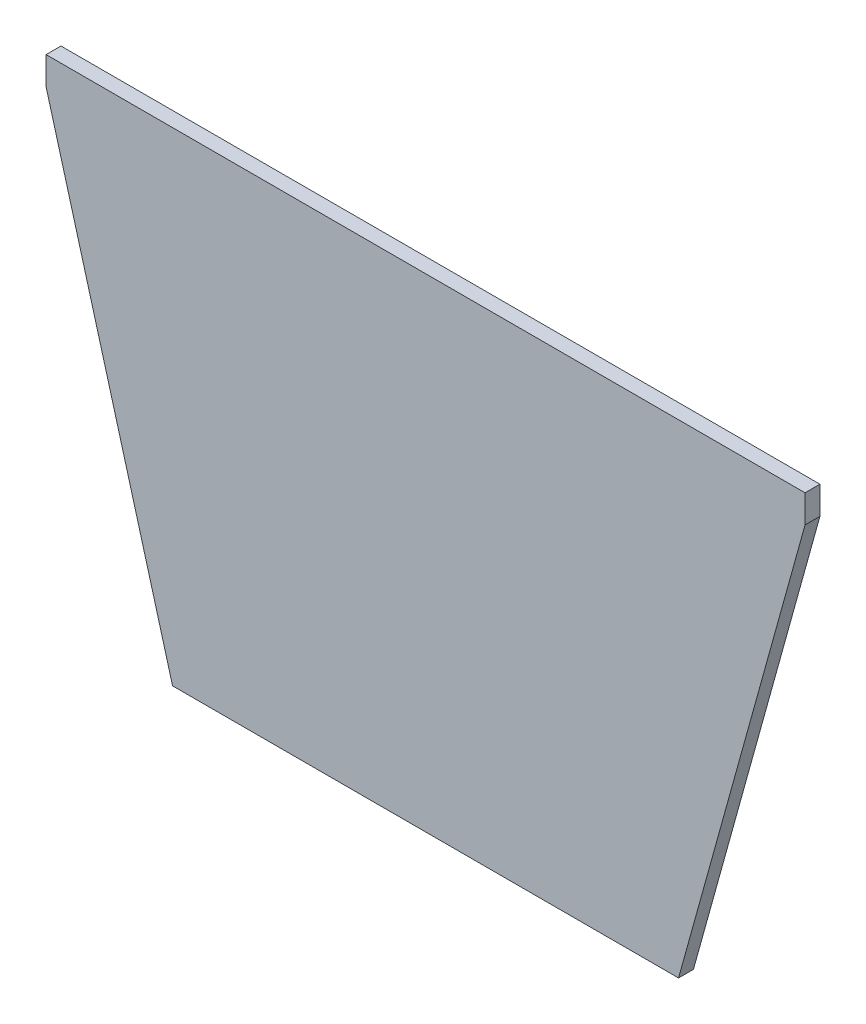
ISO-10303-21;
HEADER;
FILE_DESCRIPTION(('STEP AP214'),'2;1');
FILE_NAME('part.step','',(''),(''),'','','');
FILE_SCHEMA(('AUTOMOTIVE_DESIGN { 1 0 10303 214 1 1 1 1 }'));
ENDSEC;
DATA;
#1=APPLICATION_CONTEXT('core data for automotive mechanical design processes');
#2=APPLICATION_PROTOCOL_DEFINITION('international standard','automotive_design',2000,#1);
#3=PRODUCT_CONTEXT('',#1,'mechanical');
#4=PRODUCT('Part','Part','',(#3));
#5=PRODUCT_RELATED_PRODUCT_CATEGORY('part','',(#4));
#6=PRODUCT_DEFINITION_FORMATION('','',#4);
#7=PRODUCT_DEFINITION_CONTEXT('part definition',#1,'design');
#8=PRODUCT_DEFINITION('design','',#6,#7);
#9=PRODUCT_DEFINITION_SHAPE('','',#8);
#10=(LENGTH_UNIT() NAMED_UNIT(*) SI_UNIT(.MILLI.,.METRE.));
#11=(NAMED_UNIT(*) PLANE_ANGLE_UNIT() SI_UNIT($,.RADIAN.));
#12=(NAMED_UNIT(*) SI_UNIT($,.STERADIAN.) SOLID_ANGLE_UNIT());
#13=UNCERTAINTY_MEASURE_WITH_UNIT(LENGTH_MEASURE(1.E-05),#10,'distance_accuracy_value','');
#14=(GEOMETRIC_REPRESENTATION_CONTEXT(3) GLOBAL_UNCERTAINTY_ASSIGNED_CONTEXT((#13)) GLOBAL_UNIT_ASSIGNED_CONTEXT((#10,
#11,#12)) REPRESENTATION_CONTEXT('',''));
#15=CARTESIAN_POINT('',(0.,0.,0.));
#16=DIRECTION('',(0.,0.,1.));
#17=DIRECTION('',(1.,0.,0.));
#18=AXIS2_PLACEMENT_3D('',#15,#16,#17);
#19=CARTESIAN_POINT('',(0.,122.427999591597,4.));
#20=DIRECTION('',(1.,0.,0.));
#21=DIRECTION('',(0.,0.,-1.));
#22=AXIS2_PLACEMENT_3D('',#19,#20,#21);
#23=PLANE('',#22);
#24=DIRECTION('',(0.,-1.,0.));
#25=VECTOR('',#24,1.);
#26=CARTESIAN_POINT('',(0.,122.427999591597,0.));
#27=LINE('',#26,#25);
#28=CARTESIAN_POINT('',(0.,129.927999591597,0.));
#29=VERTEX_POINT('',#28);
#30=CARTESIAN_POINT('',(0.,122.427999591597,0.));
#31=VERTEX_POINT('',#30);
#32=EDGE_CURVE('E134',#29,#31,#27,.T.);
#33=ORIENTED_EDGE('',*,*,#32,.T.);
#34=DIRECTION('',(0.,0.,-1.));
#35=VECTOR('',#34,1.);
#36=CARTESIAN_POINT('',(0.,122.427999591597,4.));
#37=LINE('',#36,#35);
#38=CARTESIAN_POINT('',(0.,122.427999591597,4.));
#39=VERTEX_POINT('',#38);
#40=EDGE_CURVE('E11',#39,#31,#37,.T.);
#41=ORIENTED_EDGE('',*,*,#40,.F.);
#42=DIRECTION('',(0.,-1.,0.));
#43=VECTOR('',#42,1.);
#44=CARTESIAN_POINT('',(0.,122.427999591597,4.));
#45=LINE('',#44,#43);
#46=CARTESIAN_POINT('',(0.,129.927999591597,4.));
#47=VERTEX_POINT('',#46);
#48=EDGE_CURVE('E150',#47,#39,#45,.T.);
#49=ORIENTED_EDGE('',*,*,#48,.F.);
#50=DIRECTION('',(0.,0.,-1.));
#51=VECTOR('',#50,1.);
#52=CARTESIAN_POINT('',(0.,129.927999591597,4.));
#53=LINE('',#52,#51);
#54=EDGE_CURVE('E130',#47,#29,#53,.T.);
#55=ORIENTED_EDGE('',*,*,#54,.T.);
#56=EDGE_LOOP('',(#33,#41,#49,#55));
#57=FACE_BOUND('',#56,.T.);
#58=ADVANCED_FACE('F45',(#57),#23,.F.);
#59=CARTESIAN_POINT('',(0.,122.427999591597,4.));
#60=DIRECTION('',(0.963551954088476,0.2675212734948,0.));
#61=DIRECTION('',(-0.2675212734948,0.963551954088476,0.));
#62=AXIS2_PLACEMENT_3D('',#59,#60,#61);
#63=PLANE('',#62);
#64=DIRECTION('',(0.2675212734948,-0.963551954088476,0.));
#65=VECTOR('',#64,1.);
#66=CARTESIAN_POINT('',(0.,122.427999591597,0.));
#67=LINE('',#66,#65);
#68=CARTESIAN_POINT('',(33.991,-4.08403325047324E-07,0.));
#69=VERTEX_POINT('',#68);
#70=EDGE_CURVE('E138',#31,#69,#67,.T.);
#71=ORIENTED_EDGE('',*,*,#70,.T.);
#72=DIRECTION('',(0.,0.,-1.));
#73=VECTOR('',#72,1.);
#74=CARTESIAN_POINT('',(33.991,-4.08403325047324E-07,4.));
#75=LINE('',#74,#73);
#76=CARTESIAN_POINT('',(33.991,-4.08403325047324E-07,4.));
#77=VERTEX_POINT('',#76);
#78=EDGE_CURVE('E54',#77,#69,#75,.T.);
#79=ORIENTED_EDGE('',*,*,#78,.F.);
#80=DIRECTION('',(0.2675212734948,-0.963551954088476,0.));
#81=VECTOR('',#80,1.);
#82=CARTESIAN_POINT('',(0.,122.427999591597,4.));
#83=LINE('',#82,#81);
#84=EDGE_CURVE('E99',#39,#77,#83,.T.);
#85=ORIENTED_EDGE('',*,*,#84,.F.);
#86=ORIENTED_EDGE('',*,*,#40,.T.);
#87=EDGE_LOOP('',(#71,#79,#85,#86));
#88=FACE_BOUND('',#87,.T.);
#89=ADVANCED_FACE('F178',(#88),#63,.F.);
#90=CARTESIAN_POINT('',(33.991,-4.08403325047324E-07,4.));
#91=DIRECTION('',(0.,1.,0.));
#92=DIRECTION('',(-1.,0.,0.));
#93=AXIS2_PLACEMENT_3D('',#90,#91,#92);
#94=PLANE('',#93);
#95=DIRECTION('',(1.,0.,0.));
#96=VECTOR('',#95,1.);
#97=CARTESIAN_POINT('',(33.991,-4.08403325047324E-07,0.));
#98=LINE('',#97,#96);
#99=CARTESIAN_POINT('',(169.971,-4.08403308394577E-07,0.));
#100=VERTEX_POINT('',#99);
#101=EDGE_CURVE('E141',#69,#100,#98,.T.);
#102=ORIENTED_EDGE('',*,*,#101,.T.);
#103=DIRECTION('',(0.,0.,-1.));
#104=VECTOR('',#103,1.);
#105=CARTESIAN_POINT('',(169.971,-4.08403308394577E-07,4.));
#106=LINE('',#105,#104);
#107=CARTESIAN_POINT('',(169.971,-4.08403308394577E-07,4.));
#108=VERTEX_POINT('',#107);
#109=EDGE_CURVE('E123',#108,#100,#106,.T.);
#110=ORIENTED_EDGE('',*,*,#109,.F.);
#111=DIRECTION('',(1.,0.,0.));
#112=VECTOR('',#111,1.);
#113=CARTESIAN_POINT('',(33.991,-4.08403325047324E-07,4.));
#114=LINE('',#113,#112);
#115=EDGE_CURVE('E112',#77,#108,#114,.T.);
#116=ORIENTED_EDGE('',*,*,#115,.F.);
#117=ORIENTED_EDGE('',*,*,#78,.T.);
#118=EDGE_LOOP('',(#102,#110,#116,#117));
#119=FACE_BOUND('',#118,.T.);
#120=ADVANCED_FACE('F160',(#119),#94,.F.);
#121=CARTESIAN_POINT('',(203.962,122.427999591597,4.));
#122=DIRECTION('',(-0.963551954088476,0.2675212734948,0.));
#123=DIRECTION('',(-0.2675212734948,-0.963551954088476,0.));
#124=AXIS2_PLACEMENT_3D('',#121,#122,#123);
#125=PLANE('',#124);
#126=DIRECTION('',(0.2675212734948,0.963551954088476,0.));
#127=VECTOR('',#126,1.);
#128=CARTESIAN_POINT('',(203.962,122.427999591597,0.));
#129=LINE('',#128,#127);
#130=CARTESIAN_POINT('',(203.962,122.427999591597,0.));
#131=VERTEX_POINT('',#130);
#132=EDGE_CURVE('E121',#100,#131,#129,.T.);
#133=ORIENTED_EDGE('',*,*,#132,.T.);
#134=DIRECTION('',(0.,0.,-1.));
#135=VECTOR('',#134,1.);
#136=CARTESIAN_POINT('',(203.962,122.427999591597,4.));
#137=LINE('',#136,#135);
#138=CARTESIAN_POINT('',(203.962,122.427999591597,4.));
#139=VERTEX_POINT('',#138);
#140=EDGE_CURVE('E118',#139,#131,#137,.T.);
#141=ORIENTED_EDGE('',*,*,#140,.F.);
#142=DIRECTION('',(0.2675212734948,0.963551954088476,0.));
#143=VECTOR('',#142,1.);
#144=CARTESIAN_POINT('',(203.962,122.427999591597,4.));
#145=LINE('',#144,#143);
#146=EDGE_CURVE('E106',#108,#139,#145,.T.);
#147=ORIENTED_EDGE('',*,*,#146,.F.);
#148=ORIENTED_EDGE('',*,*,#109,.T.);
#149=EDGE_LOOP('',(#133,#141,#147,#148));
#150=FACE_BOUND('',#149,.T.);
#151=ADVANCED_FACE('F119',(#150),#125,.F.);
#152=CARTESIAN_POINT('',(203.962,129.927999591597,4.));
#153=DIRECTION('',(-1.,0.,0.));
#154=DIRECTION('',(0.,0.,1.));
#155=AXIS2_PLACEMENT_3D('',#152,#153,#154);
#156=PLANE('',#155);
#157=DIRECTION('',(0.,1.,0.));
#158=VECTOR('',#157,1.);
#159=CARTESIAN_POINT('',(203.962,129.927999591597,0.));
#160=LINE('',#159,#158);
#161=CARTESIAN_POINT('',(203.962,129.927999591597,0.));
#162=VERTEX_POINT('',#161);
#163=EDGE_CURVE('E85',#131,#162,#160,.T.);
#164=ORIENTED_EDGE('',*,*,#163,.T.);
#165=DIRECTION('',(0.,0.,-1.));
#166=VECTOR('',#165,1.);
#167=CARTESIAN_POINT('',(203.962,129.927999591597,4.));
#168=LINE('',#167,#166);
#169=CARTESIAN_POINT('',(203.962,129.927999591597,4.));
#170=VERTEX_POINT('',#169);
#171=EDGE_CURVE('E124',#170,#162,#168,.T.);
#172=ORIENTED_EDGE('',*,*,#171,.F.);
#173=DIRECTION('',(0.,1.,0.));
#174=VECTOR('',#173,1.);
#175=CARTESIAN_POINT('',(203.962,129.927999591597,4.));
#176=LINE('',#175,#174);
#177=EDGE_CURVE('E110',#139,#170,#176,.T.);
#178=ORIENTED_EDGE('',*,*,#177,.F.);
#179=ORIENTED_EDGE('',*,*,#140,.T.);
#180=EDGE_LOOP('',(#164,#172,#178,#179));
#181=FACE_BOUND('',#180,.T.);
#182=ADVANCED_FACE('F126',(#181),#156,.F.);
#183=CARTESIAN_POINT('',(0.,129.927999591597,4.));
#184=DIRECTION('',(0.,-1.,0.));
#185=DIRECTION('',(1.,0.,0.));
#186=AXIS2_PLACEMENT_3D('',#183,#184,#185);
#187=PLANE('',#186);
#188=DIRECTION('',(-1.,0.,0.));
#189=VECTOR('',#188,1.);
#190=CARTESIAN_POINT('',(0.,129.927999591597,0.));
#191=LINE('',#190,#189);
#192=EDGE_CURVE('E91',#162,#29,#191,.T.);
#193=ORIENTED_EDGE('',*,*,#192,.T.);
#194=ORIENTED_EDGE('',*,*,#54,.F.);
#195=DIRECTION('',(-1.,0.,0.));
#196=VECTOR('',#195,1.);
#197=CARTESIAN_POINT('',(0.,129.927999591597,4.));
#198=LINE('',#197,#196);
#199=EDGE_CURVE('E62',#170,#47,#198,.T.);
#200=ORIENTED_EDGE('',*,*,#199,.F.);
#201=ORIENTED_EDGE('',*,*,#171,.T.);
#202=EDGE_LOOP('',(#193,#194,#200,#201));
#203=FACE_BOUND('',#202,.T.);
#204=ADVANCED_FACE('F167',(#203),#187,.F.);
#205=CARTESIAN_POINT('',(0.,0.,4.));
#206=DIRECTION('',(0.,0.,-1.));
#207=DIRECTION('',(-1.,0.,0.));
#208=AXIS2_PLACEMENT_3D('',#205,#206,#207);
#209=PLANE('',#208);
#210=ORIENTED_EDGE('',*,*,#48,.T.);
#211=ORIENTED_EDGE('',*,*,#84,.T.);
#212=ORIENTED_EDGE('',*,*,#115,.T.);
#213=ORIENTED_EDGE('',*,*,#146,.T.);
#214=ORIENTED_EDGE('',*,*,#177,.T.);
#215=ORIENTED_EDGE('',*,*,#199,.T.);
#216=EDGE_LOOP('',(#210,#211,#212,#213,#214,#215));
#217=FACE_BOUND('',#216,.T.);
#218=ADVANCED_FACE('F108',(#217),#209,.F.);
#219=CARTESIAN_POINT('',(0.,0.,0.));
#220=DIRECTION('',(0.,0.,-1.));
#221=DIRECTION('',(-1.,0.,0.));
#222=AXIS2_PLACEMENT_3D('',#219,#220,#221);
#223=PLANE('',#222);
#224=ORIENTED_EDGE('',*,*,#32,.F.);
#225=ORIENTED_EDGE('',*,*,#192,.F.);
#226=ORIENTED_EDGE('',*,*,#163,.F.);
#227=ORIENTED_EDGE('',*,*,#132,.F.);
#228=ORIENTED_EDGE('',*,*,#101,.F.);
#229=ORIENTED_EDGE('',*,*,#70,.F.);
#230=EDGE_LOOP('',(#224,#225,#226,#227,#228,#229));
#231=FACE_BOUND('',#230,.T.);
#232=ADVANCED_FACE('F163',(#231),#223,.T.);
#233=CLOSED_SHELL('',(#58,#89,#120,#151,#182,#204,#218,#232));
#234=MANIFOLD_SOLID_BREP('B2',#233);
#235=ADVANCED_BREP_SHAPE_REPRESENTATION('',(#18,#234),#14);
#236=SHAPE_DEFINITION_REPRESENTATION(#9,#235);
ENDSEC;
END-ISO-10303-21;
